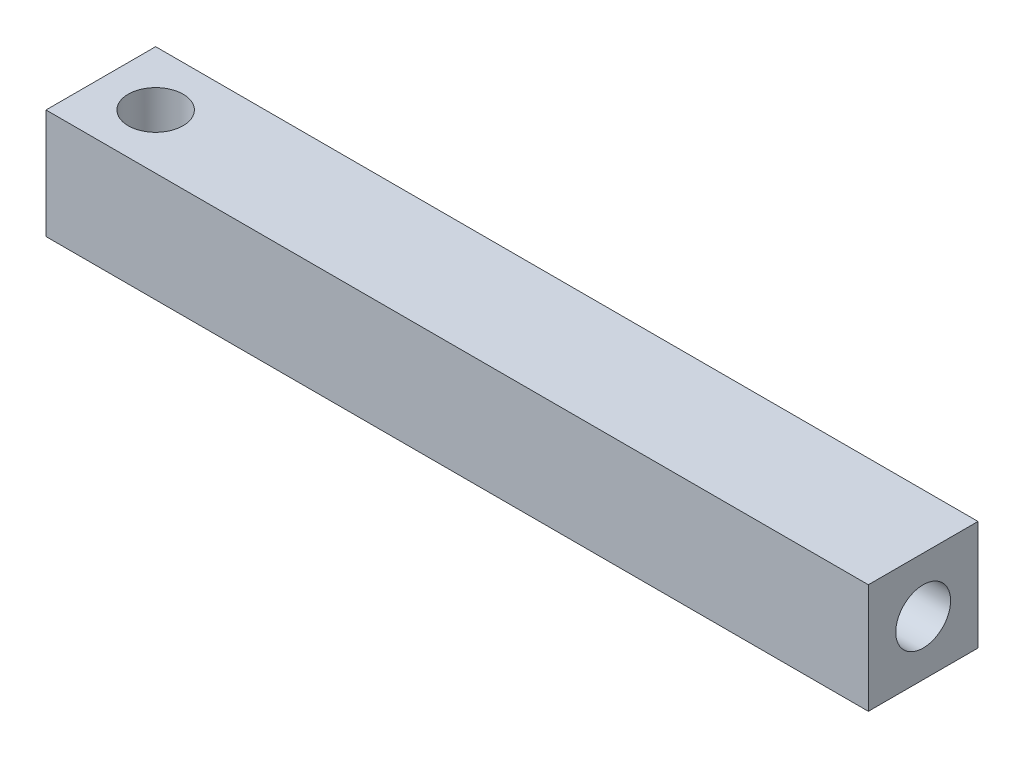
ISO-10303-21;
HEADER;
FILE_DESCRIPTION(('STEP AP214'),'2;1');
FILE_NAME('part.step','',(''),(''),'','','');
FILE_SCHEMA(('AUTOMOTIVE_DESIGN { 1 0 10303 214 1 1 1 1 }'));
ENDSEC;
DATA;
#1=APPLICATION_CONTEXT('core data for automotive mechanical design processes');
#2=APPLICATION_PROTOCOL_DEFINITION('international standard','automotive_design',2000,#1);
#3=PRODUCT_CONTEXT('',#1,'mechanical');
#4=PRODUCT('Part','Part','',(#3));
#5=PRODUCT_RELATED_PRODUCT_CATEGORY('part','',(#4));
#6=PRODUCT_DEFINITION_FORMATION('','',#4);
#7=PRODUCT_DEFINITION_CONTEXT('part definition',#1,'design');
#8=PRODUCT_DEFINITION('design','',#6,#7);
#9=PRODUCT_DEFINITION_SHAPE('','',#8);
#10=(LENGTH_UNIT() NAMED_UNIT(*) SI_UNIT(.MILLI.,.METRE.));
#11=(NAMED_UNIT(*) PLANE_ANGLE_UNIT() SI_UNIT($,.RADIAN.));
#12=(NAMED_UNIT(*) SI_UNIT($,.STERADIAN.) SOLID_ANGLE_UNIT());
#13=UNCERTAINTY_MEASURE_WITH_UNIT(LENGTH_MEASURE(1.E-05),#10,'distance_accuracy_value','');
#14=(GEOMETRIC_REPRESENTATION_CONTEXT(3) GLOBAL_UNCERTAINTY_ASSIGNED_CONTEXT((#13)) GLOBAL_UNIT_ASSIGNED_CONTEXT((#10,
#11,#12)) REPRESENTATION_CONTEXT('',''));
#15=CARTESIAN_POINT('',(0.,0.,0.));
#16=DIRECTION('',(0.,0.,1.));
#17=DIRECTION('',(1.,0.,0.));
#18=AXIS2_PLACEMENT_3D('',#15,#16,#17);
#19=CARTESIAN_POINT('',(300.,-20.,-20.));
#20=DIRECTION('',(0.,0.,1.));
#21=DIRECTION('',(1.,0.,0.));
#22=AXIS2_PLACEMENT_3D('',#19,#20,#21);
#23=PLANE('',#22);
#24=DIRECTION('',(0.,1.,0.));
#25=VECTOR('',#24,1.);
#26=CARTESIAN_POINT('',(0.,-20.,-20.));
#27=LINE('',#26,#25);
#28=CARTESIAN_POINT('',(0.,-20.,-20.));
#29=VERTEX_POINT('',#28);
#30=CARTESIAN_POINT('',(0.,20.,-20.));
#31=VERTEX_POINT('',#30);
#32=EDGE_CURVE('E102',#29,#31,#27,.T.);
#33=ORIENTED_EDGE('',*,*,#32,.T.);
#34=DIRECTION('',(-1.,0.,0.));
#35=VECTOR('',#34,1.);
#36=CARTESIAN_POINT('',(300.,20.,-20.));
#37=LINE('',#36,#35);
#38=CARTESIAN_POINT('',(300.,20.,-20.));
#39=VERTEX_POINT('',#38);
#40=EDGE_CURVE('E11',#39,#31,#37,.T.);
#41=ORIENTED_EDGE('',*,*,#40,.F.);
#42=DIRECTION('',(0.,1.,0.));
#43=VECTOR('',#42,1.);
#44=CARTESIAN_POINT('',(300.,-20.,-20.));
#45=LINE('',#44,#43);
#46=CARTESIAN_POINT('',(300.,-20.,-20.));
#47=VERTEX_POINT('',#46);
#48=EDGE_CURVE('E93',#47,#39,#45,.T.);
#49=ORIENTED_EDGE('',*,*,#48,.F.);
#50=DIRECTION('',(-1.,0.,0.));
#51=VECTOR('',#50,1.);
#52=CARTESIAN_POINT('',(300.,-20.,-20.));
#53=LINE('',#52,#51);
#54=EDGE_CURVE('E99',#47,#29,#53,.T.);
#55=ORIENTED_EDGE('',*,*,#54,.T.);
#56=EDGE_LOOP('',(#33,#41,#49,#55));
#57=FACE_BOUND('',#56,.T.);
#58=ADVANCED_FACE('F39',(#57),#23,.F.);
#59=CARTESIAN_POINT('',(300.,20.,20.));
#60=DIRECTION('',(0.,-1.,0.));
#61=DIRECTION('',(0.,0.,-1.));
#62=AXIS2_PLACEMENT_3D('',#59,#60,#61);
#63=PLANE('',#62);
#64=CARTESIAN_POINT('',(20.,20.,0.));
#65=DIRECTION('',(0.,-1.,0.));
#66=DIRECTION('',(0.,0.,-1.));
#67=AXIS2_PLACEMENT_3D('',#64,#65,#66);
#68=CIRCLE('',#67,10.);
#69=CARTESIAN_POINT('',(20.,20.,-10.));
#70=VERTEX_POINT('',#69);
#71=EDGE_CURVE('E110',#70,#70,#68,.T.);
#72=ORIENTED_EDGE('',*,*,#71,.T.);
#73=EDGE_LOOP('',(#72));
#74=FACE_BOUND('',#73,.T.);
#75=DIRECTION('',(0.,0.,1.));
#76=VECTOR('',#75,1.);
#77=CARTESIAN_POINT('',(0.,20.,20.));
#78=LINE('',#77,#76);
#79=CARTESIAN_POINT('',(0.,20.,20.));
#80=VERTEX_POINT('',#79);
#81=EDGE_CURVE('E92',#31,#80,#78,.T.);
#82=ORIENTED_EDGE('',*,*,#81,.T.);
#83=DIRECTION('',(-1.,0.,0.));
#84=VECTOR('',#83,1.);
#85=CARTESIAN_POINT('',(300.,20.,20.));
#86=LINE('',#85,#84);
#87=CARTESIAN_POINT('',(300.,20.,20.));
#88=VERTEX_POINT('',#87);
#89=EDGE_CURVE('E48',#88,#80,#86,.T.);
#90=ORIENTED_EDGE('',*,*,#89,.F.);
#91=DIRECTION('',(0.,0.,1.));
#92=VECTOR('',#91,1.);
#93=CARTESIAN_POINT('',(300.,20.,20.));
#94=LINE('',#93,#92);
#95=EDGE_CURVE('E88',#39,#88,#94,.T.);
#96=ORIENTED_EDGE('',*,*,#95,.F.);
#97=ORIENTED_EDGE('',*,*,#40,.T.);
#98=EDGE_LOOP('',(#82,#90,#96,#97));
#99=FACE_BOUND('',#98,.T.);
#100=ADVANCED_FACE('F94',(#74,#99),#63,.F.);
#101=CARTESIAN_POINT('',(300.,-20.,20.));
#102=DIRECTION('',(0.,0.,-1.));
#103=DIRECTION('',(-1.,0.,0.));
#104=AXIS2_PLACEMENT_3D('',#101,#102,#103);
#105=PLANE('',#104);
#106=DIRECTION('',(0.,-1.,0.));
#107=VECTOR('',#106,1.);
#108=CARTESIAN_POINT('',(0.,-20.,20.));
#109=LINE('',#108,#107);
#110=CARTESIAN_POINT('',(0.,-20.,20.));
#111=VERTEX_POINT('',#110);
#112=EDGE_CURVE('E71',#80,#111,#109,.T.);
#113=ORIENTED_EDGE('',*,*,#112,.T.);
#114=DIRECTION('',(-1.,0.,0.));
#115=VECTOR('',#114,1.);
#116=CARTESIAN_POINT('',(300.,-20.,20.));
#117=LINE('',#116,#115);
#118=CARTESIAN_POINT('',(300.,-20.,20.));
#119=VERTEX_POINT('',#118);
#120=EDGE_CURVE('E96',#119,#111,#117,.T.);
#121=ORIENTED_EDGE('',*,*,#120,.F.);
#122=DIRECTION('',(0.,-1.,0.));
#123=VECTOR('',#122,1.);
#124=CARTESIAN_POINT('',(300.,-20.,20.));
#125=LINE('',#124,#123);
#126=EDGE_CURVE('E90',#88,#119,#125,.T.);
#127=ORIENTED_EDGE('',*,*,#126,.F.);
#128=ORIENTED_EDGE('',*,*,#89,.T.);
#129=EDGE_LOOP('',(#113,#121,#127,#128));
#130=FACE_BOUND('',#129,.T.);
#131=ADVANCED_FACE('F98',(#130),#105,.F.);
#132=CARTESIAN_POINT('',(300.,-20.,20.));
#133=DIRECTION('',(0.,1.,0.));
#134=DIRECTION('',(0.,0.,1.));
#135=AXIS2_PLACEMENT_3D('',#132,#133,#134);
#136=PLANE('',#135);
#137=CARTESIAN_POINT('',(20.,-20.,0.));
#138=DIRECTION('',(0.,1.,0.));
#139=DIRECTION('',(0.,0.,1.));
#140=AXIS2_PLACEMENT_3D('',#137,#138,#139);
#141=CIRCLE('',#140,10.);
#142=CARTESIAN_POINT('',(20.,-20.,10.));
#143=VERTEX_POINT('',#142);
#144=EDGE_CURVE('E45',#143,#143,#141,.T.);
#145=ORIENTED_EDGE('',*,*,#144,.T.);
#146=EDGE_LOOP('',(#145));
#147=FACE_BOUND('',#146,.T.);
#148=DIRECTION('',(0.,0.,-1.));
#149=VECTOR('',#148,1.);
#150=CARTESIAN_POINT('',(0.,-20.,20.));
#151=LINE('',#150,#149);
#152=EDGE_CURVE('E78',#111,#29,#151,.T.);
#153=ORIENTED_EDGE('',*,*,#152,.T.);
#154=ORIENTED_EDGE('',*,*,#54,.F.);
#155=DIRECTION('',(0.,0.,-1.));
#156=VECTOR('',#155,1.);
#157=CARTESIAN_POINT('',(300.,-20.,20.));
#158=LINE('',#157,#156);
#159=EDGE_CURVE('E57',#119,#47,#158,.T.);
#160=ORIENTED_EDGE('',*,*,#159,.F.);
#161=ORIENTED_EDGE('',*,*,#120,.T.);
#162=EDGE_LOOP('',(#153,#154,#160,#161));
#163=FACE_BOUND('',#162,.T.);
#164=ADVANCED_FACE('F115',(#147,#163),#136,.F.);
#165=CARTESIAN_POINT('',(300.,0.,0.));
#166=DIRECTION('',(-1.,0.,0.));
#167=DIRECTION('',(0.,0.,1.));
#168=AXIS2_PLACEMENT_3D('',#165,#166,#167);
#169=PLANE('',#168);
#170=CARTESIAN_POINT('',(300.,0.,0.));
#171=DIRECTION('',(1.,0.,0.));
#172=DIRECTION('',(0.,0.,-1.));
#173=AXIS2_PLACEMENT_3D('',#170,#171,#172);
#174=CIRCLE('',#173,10.);
#175=CARTESIAN_POINT('',(300.,0.,-10.));
#176=VERTEX_POINT('',#175);
#177=EDGE_CURVE('E120',#176,#176,#174,.T.);
#178=ORIENTED_EDGE('',*,*,#177,.F.);
#179=EDGE_LOOP('',(#178));
#180=FACE_BOUND('',#179,.T.);
#181=ORIENTED_EDGE('',*,*,#48,.T.);
#182=ORIENTED_EDGE('',*,*,#95,.T.);
#183=ORIENTED_EDGE('',*,*,#126,.T.);
#184=ORIENTED_EDGE('',*,*,#159,.T.);
#185=EDGE_LOOP('',(#181,#182,#183,#184));
#186=FACE_BOUND('',#185,.T.);
#187=ADVANCED_FACE('F87',(#180,#186),#169,.F.);
#188=CARTESIAN_POINT('',(0.,0.,0.));
#189=DIRECTION('',(-1.,0.,0.));
#190=DIRECTION('',(0.,0.,1.));
#191=AXIS2_PLACEMENT_3D('',#188,#189,#190);
#192=PLANE('',#191);
#193=ORIENTED_EDGE('',*,*,#32,.F.);
#194=ORIENTED_EDGE('',*,*,#152,.F.);
#195=ORIENTED_EDGE('',*,*,#112,.F.);
#196=ORIENTED_EDGE('',*,*,#81,.F.);
#197=EDGE_LOOP('',(#193,#194,#195,#196));
#198=FACE_BOUND('',#197,.T.);
#199=ADVANCED_FACE('F113',(#198),#192,.T.);
#200=CARTESIAN_POINT('',(20.,-80.,0.));
#201=DIRECTION('',(0.,1.,0.));
#202=DIRECTION('',(0.,0.,1.));
#203=AXIS2_PLACEMENT_3D('',#200,#201,#202);
#204=CYLINDRICAL_SURFACE('',#203,10.);
#205=ORIENTED_EDGE('',*,*,#144,.F.);
#206=EDGE_LOOP('',(#205));
#207=FACE_BOUND('',#206,.T.);
#208=ORIENTED_EDGE('',*,*,#71,.F.);
#209=EDGE_LOOP('',(#208));
#210=FACE_BOUND('',#209,.T.);
#211=ADVANCED_FACE('F131',(#207,#210),#204,.F.);
#212=CARTESIAN_POINT('',(270.,0.,0.));
#213=DIRECTION('',(1.,0.,0.));
#214=DIRECTION('',(0.,0.,-1.));
#215=AXIS2_PLACEMENT_3D('',#212,#213,#214);
#216=CYLINDRICAL_SURFACE('',#215,10.);
#217=CARTESIAN_POINT('',(270.,0.,0.));
#218=DIRECTION('',(1.,0.,0.));
#219=DIRECTION('',(0.,0.,-1.));
#220=AXIS2_PLACEMENT_3D('',#217,#218,#219);
#221=CIRCLE('',#220,10.);
#222=CARTESIAN_POINT('',(270.,0.,-10.));
#223=VERTEX_POINT('',#222);
#224=EDGE_CURVE('E125',#223,#223,#221,.T.);
#225=ORIENTED_EDGE('',*,*,#224,.F.);
#226=EDGE_LOOP('',(#225));
#227=FACE_BOUND('',#226,.T.);
#228=ORIENTED_EDGE('',*,*,#177,.T.);
#229=EDGE_LOOP('',(#228));
#230=FACE_BOUND('',#229,.T.);
#231=ADVANCED_FACE('F133',(#227,#230),#216,.F.);
#232=CARTESIAN_POINT('',(270.,0.,0.));
#233=DIRECTION('',(1.,0.,0.));
#234=DIRECTION('',(0.,0.,-1.));
#235=AXIS2_PLACEMENT_3D('',#232,#233,#234);
#236=PLANE('',#235);
#237=ORIENTED_EDGE('',*,*,#224,.T.);
#238=EDGE_LOOP('',(#237));
#239=FACE_BOUND('',#238,.T.);
#240=ADVANCED_FACE('F152',(#239),#236,.T.);
#241=CLOSED_SHELL('',(#58,#100,#131,#164,#187,#199,#211,#231,#240));
#242=MANIFOLD_SOLID_BREP('B2',#241);
#243=ADVANCED_BREP_SHAPE_REPRESENTATION('',(#18,#242),#14);
#244=SHAPE_DEFINITION_REPRESENTATION(#9,#243);
ENDSEC;
END-ISO-10303-21;
